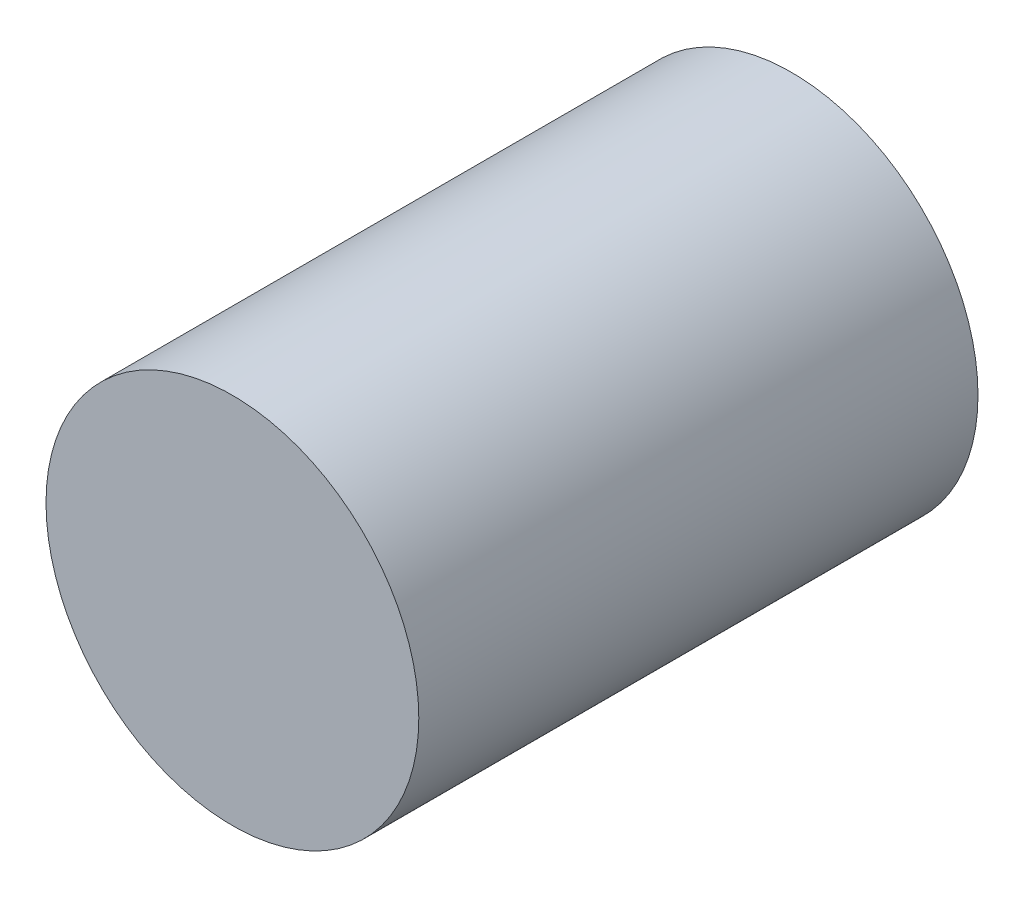
ISO-10303-21;
HEADER;
FILE_DESCRIPTION(('STEP AP214'),'2;1');
FILE_NAME('part.step','',(''),(''),'','','');
FILE_SCHEMA(('AUTOMOTIVE_DESIGN { 1 0 10303 214 1 1 1 1 }'));
ENDSEC;
DATA;
#1=APPLICATION_CONTEXT('core data for automotive mechanical design processes');
#2=APPLICATION_PROTOCOL_DEFINITION('international standard','automotive_design',2000,#1);
#3=PRODUCT_CONTEXT('',#1,'mechanical');
#4=PRODUCT('Part','Part','',(#3));
#5=PRODUCT_RELATED_PRODUCT_CATEGORY('part','',(#4));
#6=PRODUCT_DEFINITION_FORMATION('','',#4);
#7=PRODUCT_DEFINITION_CONTEXT('part definition',#1,'design');
#8=PRODUCT_DEFINITION('design','',#6,#7);
#9=PRODUCT_DEFINITION_SHAPE('','',#8);
#10=(LENGTH_UNIT() NAMED_UNIT(*) SI_UNIT(.MILLI.,.METRE.));
#11=(NAMED_UNIT(*) PLANE_ANGLE_UNIT() SI_UNIT($,.RADIAN.));
#12=(NAMED_UNIT(*) SI_UNIT($,.STERADIAN.) SOLID_ANGLE_UNIT());
#13=UNCERTAINTY_MEASURE_WITH_UNIT(LENGTH_MEASURE(1.E-05),#10,'distance_accuracy_value','');
#14=(GEOMETRIC_REPRESENTATION_CONTEXT(3) GLOBAL_UNCERTAINTY_ASSIGNED_CONTEXT((#13)) GLOBAL_UNIT_ASSIGNED_CONTEXT((#10,
#11,#12)) REPRESENTATION_CONTEXT('',''));
#15=CARTESIAN_POINT('',(0.,0.,0.));
#16=DIRECTION('',(0.,0.,1.));
#17=DIRECTION('',(1.,0.,0.));
#18=AXIS2_PLACEMENT_3D('',#15,#16,#17);
#19=CARTESIAN_POINT('',(0.,0.,30.));
#20=DIRECTION('',(0.,0.,-1.));
#21=DIRECTION('',(-1.,0.,0.));
#22=AXIS2_PLACEMENT_3D('',#19,#20,#21);
#23=CYLINDRICAL_SURFACE('',#22,10.);
#24=CARTESIAN_POINT('',(0.,0.,30.));
#25=DIRECTION('',(0.,0.,1.));
#26=DIRECTION('',(1.,0.,0.));
#27=AXIS2_PLACEMENT_3D('',#24,#25,#26);
#28=CIRCLE('',#27,10.);
#29=CARTESIAN_POINT('',(10.,0.,30.));
#30=VERTEX_POINT('',#29);
#31=EDGE_CURVE('E10',#30,#30,#28,.T.);
#32=ORIENTED_EDGE('',*,*,#31,.F.);
#33=EDGE_LOOP('',(#32));
#34=FACE_BOUND('',#33,.T.);
#35=CARTESIAN_POINT('',(0.,0.,0.));
#36=DIRECTION('',(0.,0.,1.));
#37=DIRECTION('',(1.,0.,0.));
#38=AXIS2_PLACEMENT_3D('',#35,#36,#37);
#39=CIRCLE('',#38,10.);
#40=CARTESIAN_POINT('',(10.,0.,0.));
#41=VERTEX_POINT('',#40);
#42=EDGE_CURVE('E34',#41,#41,#39,.T.);
#43=ORIENTED_EDGE('',*,*,#42,.T.);
#44=EDGE_LOOP('',(#43));
#45=FACE_BOUND('',#44,.T.);
#46=ADVANCED_FACE('F31',(#34,#45),#23,.T.);
#47=CARTESIAN_POINT('',(0.,0.,30.));
#48=DIRECTION('',(0.,0.,1.));
#49=DIRECTION('',(1.,0.,0.));
#50=AXIS2_PLACEMENT_3D('',#47,#48,#49);
#51=PLANE('',#50);
#52=ORIENTED_EDGE('',*,*,#31,.T.);
#53=EDGE_LOOP('',(#52));
#54=FACE_BOUND('',#53,.T.);
#55=ADVANCED_FACE('F46',(#54),#51,.T.);
#56=CARTESIAN_POINT('',(0.,0.,0.));
#57=DIRECTION('',(0.,0.,1.));
#58=DIRECTION('',(1.,0.,0.));
#59=AXIS2_PLACEMENT_3D('',#56,#57,#58);
#60=PLANE('',#59);
#61=ORIENTED_EDGE('',*,*,#42,.F.);
#62=EDGE_LOOP('',(#61));
#63=FACE_BOUND('',#62,.T.);
#64=ADVANCED_FACE('F44',(#63),#60,.F.);
#65=CLOSED_SHELL('',(#46,#55,#64));
#66=MANIFOLD_SOLID_BREP('B2',#65);
#67=ADVANCED_BREP_SHAPE_REPRESENTATION('',(#18,#66),#14);
#68=SHAPE_DEFINITION_REPRESENTATION(#9,#67);
ENDSEC;
END-ISO-10303-21;
